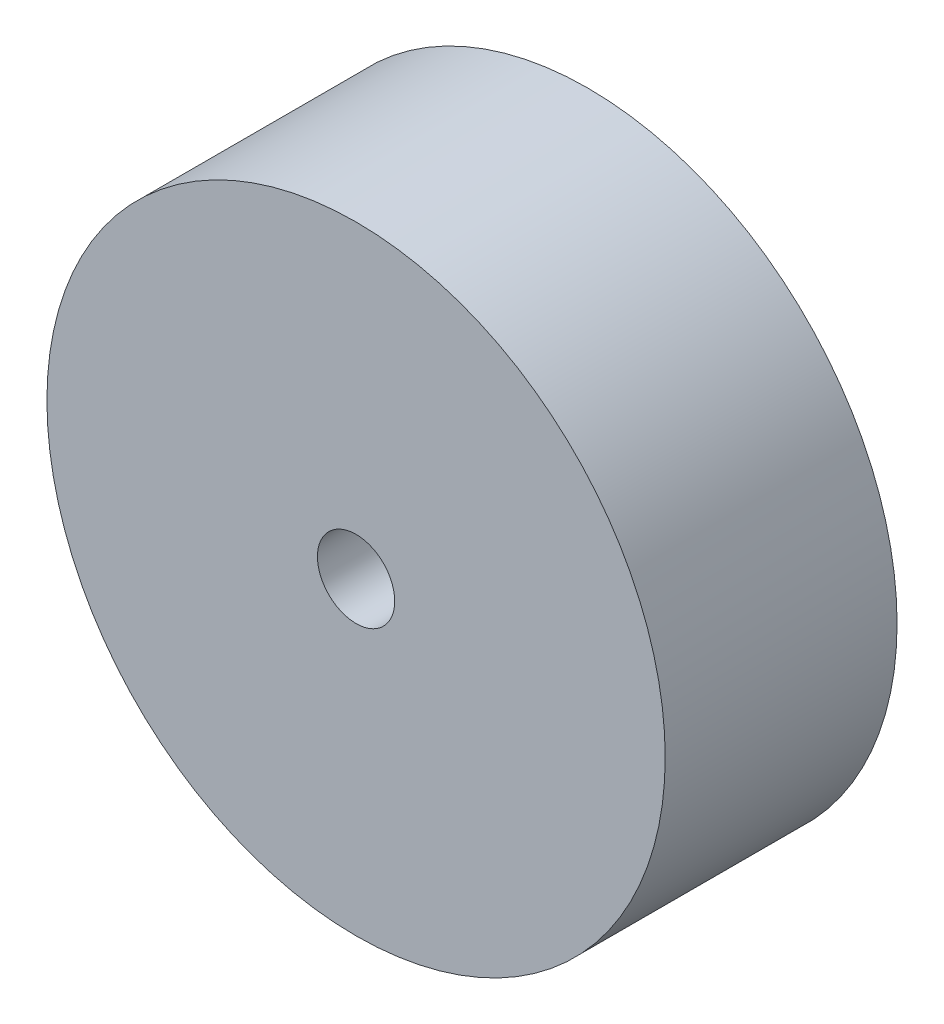
ISO-10303-21;
HEADER;
FILE_DESCRIPTION(('STEP AP214'),'2;1');
FILE_NAME('part.step','',(''),(''),'','','');
FILE_SCHEMA(('AUTOMOTIVE_DESIGN { 1 0 10303 214 1 1 1 1 }'));
ENDSEC;
DATA;
#1=APPLICATION_CONTEXT('core data for automotive mechanical design processes');
#2=APPLICATION_PROTOCOL_DEFINITION('international standard','automotive_design',2000,#1);
#3=PRODUCT_CONTEXT('',#1,'mechanical');
#4=PRODUCT('Part','Part','',(#3));
#5=PRODUCT_RELATED_PRODUCT_CATEGORY('part','',(#4));
#6=PRODUCT_DEFINITION_FORMATION('','',#4);
#7=PRODUCT_DEFINITION_CONTEXT('part definition',#1,'design');
#8=PRODUCT_DEFINITION('design','',#6,#7);
#9=PRODUCT_DEFINITION_SHAPE('','',#8);
#10=(LENGTH_UNIT() NAMED_UNIT(*) SI_UNIT(.MILLI.,.METRE.));
#11=(NAMED_UNIT(*) PLANE_ANGLE_UNIT() SI_UNIT($,.RADIAN.));
#12=(NAMED_UNIT(*) SI_UNIT($,.STERADIAN.) SOLID_ANGLE_UNIT());
#13=UNCERTAINTY_MEASURE_WITH_UNIT(LENGTH_MEASURE(1.E-05),#10,'distance_accuracy_value','');
#14=(GEOMETRIC_REPRESENTATION_CONTEXT(3) GLOBAL_UNCERTAINTY_ASSIGNED_CONTEXT((#13)) GLOBAL_UNIT_ASSIGNED_CONTEXT((#10,
#11,#12)) REPRESENTATION_CONTEXT('',''));
#15=CARTESIAN_POINT('',(0.,0.,0.));
#16=DIRECTION('',(0.,0.,1.));
#17=DIRECTION('',(1.,0.,0.));
#18=AXIS2_PLACEMENT_3D('',#15,#16,#17);
#19=CARTESIAN_POINT('',(0.,0.,-76.2));
#20=DIRECTION('',(0.,0.,1.));
#21=DIRECTION('',(1.,0.,0.));
#22=AXIS2_PLACEMENT_3D('',#19,#20,#21);
#23=CYLINDRICAL_SURFACE('',#22,101.6);
#24=CARTESIAN_POINT('',(0.,0.,-76.2));
#25=DIRECTION('',(0.,0.,1.));
#26=DIRECTION('',(1.,0.,0.));
#27=AXIS2_PLACEMENT_3D('',#24,#25,#26);
#28=CIRCLE('',#27,101.6);
#29=CARTESIAN_POINT('',(101.6,0.,-76.2));
#30=VERTEX_POINT('',#29);
#31=EDGE_CURVE('E10',#30,#30,#28,.T.);
#32=CARTESIAN_POINT('',(0.,0.,0.));
#33=DIRECTION('',(0.,0.,1.));
#34=DIRECTION('',(1.,0.,0.));
#35=AXIS2_PLACEMENT_3D('',#32,#33,#34);
#36=CIRCLE('',#35,101.6);
#37=CARTESIAN_POINT('',(101.6,0.,0.));
#38=VERTEX_POINT('',#37);
#39=EDGE_CURVE('E41',#38,#38,#36,.T.);
#40=CARTESIAN_POINT('',(101.6,0.,-76.2));
#41=CARTESIAN_POINT('',(101.6,0.,-75.40625));
#42=CARTESIAN_POINT('',(101.6,0.,-74.6125));
#43=CARTESIAN_POINT('',(101.6,0.,-73.025));
#44=CARTESIAN_POINT('',(101.6,0.,-72.23125));
#45=CARTESIAN_POINT('',(101.6,0.,-70.64375));
#46=CARTESIAN_POINT('',(101.6,0.,-69.85));
#47=CARTESIAN_POINT('',(101.6,0.,-68.2625));
#48=CARTESIAN_POINT('',(101.6,0.,-67.46875));
#49=CARTESIAN_POINT('',(101.6,0.,-65.88125));
#50=CARTESIAN_POINT('',(101.6,0.,-65.0875));
#51=CARTESIAN_POINT('',(101.6,0.,-63.5));
#52=CARTESIAN_POINT('',(101.6,0.,-62.70625));
#53=CARTESIAN_POINT('',(101.6,0.,-61.11875));
#54=CARTESIAN_POINT('',(101.6,0.,-60.325));
#55=CARTESIAN_POINT('',(101.6,0.,-58.7375));
#56=CARTESIAN_POINT('',(101.6,0.,-57.94375));
#57=CARTESIAN_POINT('',(101.6,0.,-56.35625));
#58=CARTESIAN_POINT('',(101.6,0.,-55.5625));
#59=CARTESIAN_POINT('',(101.6,0.,-53.975));
#60=CARTESIAN_POINT('',(101.6,0.,-53.18125));
#61=CARTESIAN_POINT('',(101.6,0.,-51.59375));
#62=CARTESIAN_POINT('',(101.6,0.,-50.8));
#63=CARTESIAN_POINT('',(101.6,0.,-49.2125));
#64=CARTESIAN_POINT('',(101.6,0.,-48.41875));
#65=CARTESIAN_POINT('',(101.6,0.,-46.83125));
#66=CARTESIAN_POINT('',(101.6,0.,-46.0375));
#67=CARTESIAN_POINT('',(101.6,0.,-44.45));
#68=CARTESIAN_POINT('',(101.6,0.,-43.65625));
#69=CARTESIAN_POINT('',(101.6,0.,-42.06875));
#70=CARTESIAN_POINT('',(101.6,0.,-41.275));
#71=CARTESIAN_POINT('',(101.6,0.,-39.6875));
#72=CARTESIAN_POINT('',(101.6,0.,-38.89375));
#73=CARTESIAN_POINT('',(101.6,0.,-37.30625));
#74=CARTESIAN_POINT('',(101.6,0.,-36.5125));
#75=CARTESIAN_POINT('',(101.6,0.,-34.925));
#76=CARTESIAN_POINT('',(101.6,0.,-34.13125));
#77=CARTESIAN_POINT('',(101.6,0.,-32.54375));
#78=CARTESIAN_POINT('',(101.6,0.,-31.75));
#79=CARTESIAN_POINT('',(101.6,0.,-30.1625));
#80=CARTESIAN_POINT('',(101.6,0.,-29.36875));
#81=CARTESIAN_POINT('',(101.6,0.,-27.78125));
#82=CARTESIAN_POINT('',(101.6,0.,-26.9875));
#83=CARTESIAN_POINT('',(101.6,0.,-25.4));
#84=CARTESIAN_POINT('',(101.6,0.,-24.60625));
#85=CARTESIAN_POINT('',(101.6,0.,-23.01875));
#86=CARTESIAN_POINT('',(101.6,0.,-22.225));
#87=CARTESIAN_POINT('',(101.6,0.,-20.6375));
#88=CARTESIAN_POINT('',(101.6,0.,-19.84375));
#89=CARTESIAN_POINT('',(101.6,0.,-18.25625));
#90=CARTESIAN_POINT('',(101.6,0.,-17.4625));
#91=CARTESIAN_POINT('',(101.6,0.,-15.875));
#92=CARTESIAN_POINT('',(101.6,0.,-15.08125));
#93=CARTESIAN_POINT('',(101.6,0.,-13.49375));
#94=CARTESIAN_POINT('',(101.6,0.,-12.7));
#95=CARTESIAN_POINT('',(101.6,0.,-11.1125));
#96=CARTESIAN_POINT('',(101.6,0.,-10.31875));
#97=CARTESIAN_POINT('',(101.6,0.,-8.73125));
#98=CARTESIAN_POINT('',(101.6,0.,-7.93750000000001));
#99=CARTESIAN_POINT('',(101.6,0.,-6.35));
#100=CARTESIAN_POINT('',(101.6,0.,-5.55625));
#101=CARTESIAN_POINT('',(101.6,0.,-3.96875));
#102=CARTESIAN_POINT('',(101.6,0.,-3.175));
#103=CARTESIAN_POINT('',(101.6,0.,-1.5875));
#104=CARTESIAN_POINT('',(101.6,0.,-0.793750000000001));
#105=CARTESIAN_POINT('',(101.6,0.,0.));
#106=B_SPLINE_CURVE_WITH_KNOTS('',3,(#40,#41,#42,#43,#44,#45,#46,#47,#48,#49,#50,#51,#52,#53,
#54,#55,#56,#57,#58,#59,#60,#61,#62,#63,#64,#65,#66,#67,#68,#69,#70,#71,#72,#73,#74,#75,#76,#77,
#78,#79,#80,#81,#82,#83,#84,#85,#86,#87,#88,#89,#90,#91,#92,#93,#94,#95,#96,#97,#98,#99,#100,
#101,#102,#103,#104,#105),.UNSPECIFIED.,.F.,.F.,(4,2,2,2,2,2,2,2,2,2,2,2,2,2,2,2,2,2,2,2,2,2,2,
2,2,2,2,2,2,2,2,2,4),(0.,2.38124999999999,4.76249999999999,7.14374999999999,9.52499999999999,
11.90625,14.2875,16.66875,19.05,21.43125,23.8125,26.19375,28.575,30.95625,33.3375,35.71875,38.1,
40.48125,42.8625,45.24375,47.625,50.00625,52.3875,54.76875,57.15,59.53125,61.9125,64.29375,
66.675,69.05625,71.4375,73.81875,76.2),.UNSPECIFIED.);
#107=EDGE_CURVE('BSEAM34',#30,#38,#106,.T.);
#108=ORIENTED_EDGE('',*,*,#31,.T.);
#109=ORIENTED_EDGE('',*,*,#39,.F.);
#110=ORIENTED_EDGE('',*,*,#107,.T.);
#111=ORIENTED_EDGE('',*,*,#107,.F.);
#112=EDGE_LOOP('',(#108,#110,#109,#111));
#113=FACE_BOUND('',#112,.T.);
#114=ADVANCED_FACE('F34',(#113),#23,.T.);
#115=CARTESIAN_POINT('',(0.,0.,-76.2));
#116=DIRECTION('',(0.,0.,1.));
#117=DIRECTION('',(1.,0.,0.));
#118=AXIS2_PLACEMENT_3D('',#115,#116,#117);
#119=PLANE('',#118);
#120=CARTESIAN_POINT('',(0.,0.,-76.2));
#121=DIRECTION('',(0.,0.,1.));
#122=DIRECTION('',(1.,0.,0.));
#123=AXIS2_PLACEMENT_3D('',#120,#121,#122);
#124=CIRCLE('',#123,12.7);
#125=CARTESIAN_POINT('',(12.7,0.,-76.2));
#126=VERTEX_POINT('',#125);
#127=EDGE_CURVE('E47',#126,#126,#124,.T.);
#128=ORIENTED_EDGE('',*,*,#127,.T.);
#129=EDGE_LOOP('',(#128));
#130=FACE_BOUND('',#129,.T.);
#131=ORIENTED_EDGE('',*,*,#31,.F.);
#132=EDGE_LOOP('',(#131));
#133=FACE_BOUND('',#132,.T.);
#134=ADVANCED_FACE('F60',(#130,#133),#119,.F.);
#135=CARTESIAN_POINT('',(0.,0.,0.));
#136=DIRECTION('',(0.,0.,1.));
#137=DIRECTION('',(1.,0.,0.));
#138=AXIS2_PLACEMENT_3D('',#135,#136,#137);
#139=PLANE('',#138);
#140=CARTESIAN_POINT('',(0.,0.,0.));
#141=DIRECTION('',(0.,0.,1.));
#142=DIRECTION('',(1.,0.,0.));
#143=AXIS2_PLACEMENT_3D('',#140,#141,#142);
#144=CIRCLE('',#143,12.7);
#145=CARTESIAN_POINT('',(12.7,0.,0.));
#146=VERTEX_POINT('',#145);
#147=EDGE_CURVE('E37',#146,#146,#144,.T.);
#148=ORIENTED_EDGE('',*,*,#147,.F.);
#149=EDGE_LOOP('',(#148));
#150=FACE_BOUND('',#149,.T.);
#151=ORIENTED_EDGE('',*,*,#39,.T.);
#152=EDGE_LOOP('',(#151));
#153=FACE_BOUND('',#152,.T.);
#154=ADVANCED_FACE('F57',(#150,#153),#139,.T.);
#155=CARTESIAN_POINT('',(0.,0.,-76.2));
#156=DIRECTION('',(0.,0.,1.));
#157=DIRECTION('',(1.,0.,0.));
#158=AXIS2_PLACEMENT_3D('',#155,#156,#157);
#159=CYLINDRICAL_SURFACE('',#158,12.7);
#160=CARTESIAN_POINT('',(12.7,0.,0.));
#161=CARTESIAN_POINT('',(12.7,0.,-0.793750000000001));
#162=CARTESIAN_POINT('',(12.7,0.,-1.5875));
#163=CARTESIAN_POINT('',(12.7,0.,-3.175));
#164=CARTESIAN_POINT('',(12.7,0.,-3.96875));
#165=CARTESIAN_POINT('',(12.7,0.,-5.55625));
#166=CARTESIAN_POINT('',(12.7,0.,-6.35));
#167=CARTESIAN_POINT('',(12.7,0.,-7.93750000000001));
#168=CARTESIAN_POINT('',(12.7,0.,-8.73125));
#169=CARTESIAN_POINT('',(12.7,0.,-10.31875));
#170=CARTESIAN_POINT('',(12.7,0.,-11.1125));
#171=CARTESIAN_POINT('',(12.7,0.,-12.7));
#172=CARTESIAN_POINT('',(12.7,0.,-13.49375));
#173=CARTESIAN_POINT('',(12.7,0.,-15.08125));
#174=CARTESIAN_POINT('',(12.7,0.,-15.875));
#175=CARTESIAN_POINT('',(12.7,0.,-17.4625));
#176=CARTESIAN_POINT('',(12.7,0.,-18.25625));
#177=CARTESIAN_POINT('',(12.7,0.,-19.84375));
#178=CARTESIAN_POINT('',(12.7,0.,-20.6375));
#179=CARTESIAN_POINT('',(12.7,0.,-22.225));
#180=CARTESIAN_POINT('',(12.7,0.,-23.01875));
#181=CARTESIAN_POINT('',(12.7,0.,-24.60625));
#182=CARTESIAN_POINT('',(12.7,0.,-25.4));
#183=CARTESIAN_POINT('',(12.7,0.,-26.9875));
#184=CARTESIAN_POINT('',(12.7,0.,-27.78125));
#185=CARTESIAN_POINT('',(12.7,0.,-29.36875));
#186=CARTESIAN_POINT('',(12.7,0.,-30.1625));
#187=CARTESIAN_POINT('',(12.7,0.,-31.75));
#188=CARTESIAN_POINT('',(12.7,0.,-32.54375));
#189=CARTESIAN_POINT('',(12.7,0.,-34.13125));
#190=CARTESIAN_POINT('',(12.7,0.,-34.925));
#191=CARTESIAN_POINT('',(12.7,0.,-36.5125));
#192=CARTESIAN_POINT('',(12.7,0.,-37.30625));
#193=CARTESIAN_POINT('',(12.7,0.,-38.89375));
#194=CARTESIAN_POINT('',(12.7,0.,-39.6875));
#195=CARTESIAN_POINT('',(12.7,0.,-41.275));
#196=CARTESIAN_POINT('',(12.7,0.,-42.06875));
#197=CARTESIAN_POINT('',(12.7,0.,-43.65625));
#198=CARTESIAN_POINT('',(12.7,0.,-44.45));
#199=CARTESIAN_POINT('',(12.7,0.,-46.0375));
#200=CARTESIAN_POINT('',(12.7,0.,-46.83125));
#201=CARTESIAN_POINT('',(12.7,0.,-48.41875));
#202=CARTESIAN_POINT('',(12.7,0.,-49.2125));
#203=CARTESIAN_POINT('',(12.7,0.,-50.8));
#204=CARTESIAN_POINT('',(12.7,0.,-51.59375));
#205=CARTESIAN_POINT('',(12.7,0.,-53.18125));
#206=CARTESIAN_POINT('',(12.7,0.,-53.975));
#207=CARTESIAN_POINT('',(12.7,0.,-55.5625));
#208=CARTESIAN_POINT('',(12.7,0.,-56.35625));
#209=CARTESIAN_POINT('',(12.7,0.,-57.94375));
#210=CARTESIAN_POINT('',(12.7,0.,-58.7375));
#211=CARTESIAN_POINT('',(12.7,0.,-60.325));
#212=CARTESIAN_POINT('',(12.7,0.,-61.11875));
#213=CARTESIAN_POINT('',(12.7,0.,-62.70625));
#214=CARTESIAN_POINT('',(12.7,0.,-63.5));
#215=CARTESIAN_POINT('',(12.7,0.,-65.0875));
#216=CARTESIAN_POINT('',(12.7,0.,-65.88125));
#217=CARTESIAN_POINT('',(12.7,0.,-67.46875));
#218=CARTESIAN_POINT('',(12.7,0.,-68.2625));
#219=CARTESIAN_POINT('',(12.7,0.,-69.85));
#220=CARTESIAN_POINT('',(12.7,0.,-70.64375));
#221=CARTESIAN_POINT('',(12.7,0.,-72.23125));
#222=CARTESIAN_POINT('',(12.7,0.,-73.025));
#223=CARTESIAN_POINT('',(12.7,0.,-74.6125));
#224=CARTESIAN_POINT('',(12.7,0.,-75.40625));
#225=CARTESIAN_POINT('',(12.7,0.,-76.2));
#226=B_SPLINE_CURVE_WITH_KNOTS('',3,(#160,#161,#162,#163,#164,#165,#166,#167,#168,#169,#170,
#171,#172,#173,#174,#175,#176,#177,#178,#179,#180,#181,#182,#183,#184,#185,#186,#187,#188,#189,
#190,#191,#192,#193,#194,#195,#196,#197,#198,#199,#200,#201,#202,#203,#204,#205,#206,#207,#208,
#209,#210,#211,#212,#213,#214,#215,#216,#217,#218,#219,#220,#221,#222,#223,#224,#225),
.UNSPECIFIED.,.F.,.F.,(4,2,2,2,2,2,2,2,2,2,2,2,2,2,2,2,2,2,2,2,2,2,2,2,2,2,2,2,2,2,2,2,4),(0.,
2.38125,4.7625,7.14375,9.52500000000001,11.90625,14.2875,16.66875,19.05,21.43125,23.8125,
26.19375,28.575,30.95625,33.3375,35.71875,38.1,40.48125,42.8625,45.24375,47.625,50.00625,
52.3875,54.76875,57.15,59.53125,61.9125,64.29375,66.675,69.05625,71.4375,73.81875,76.2),.UNSPECIFIED.);
#227=EDGE_CURVE('BSEAM54',#146,#126,#226,.T.);
#228=ORIENTED_EDGE('',*,*,#147,.T.);
#229=ORIENTED_EDGE('',*,*,#127,.F.);
#230=ORIENTED_EDGE('',*,*,#227,.T.);
#231=ORIENTED_EDGE('',*,*,#227,.F.);
#232=EDGE_LOOP('',(#228,#230,#229,#231));
#233=FACE_BOUND('',#232,.T.);
#234=ADVANCED_FACE('F54',(#233),#159,.F.);
#235=CLOSED_SHELL('',(#114,#134,#154,#234));
#236=MANIFOLD_SOLID_BREP('B2',#235);
#237=ADVANCED_BREP_SHAPE_REPRESENTATION('',(#18,#236),#14);
#238=SHAPE_DEFINITION_REPRESENTATION(#9,#237);
ENDSEC;
END-ISO-10303-21;
